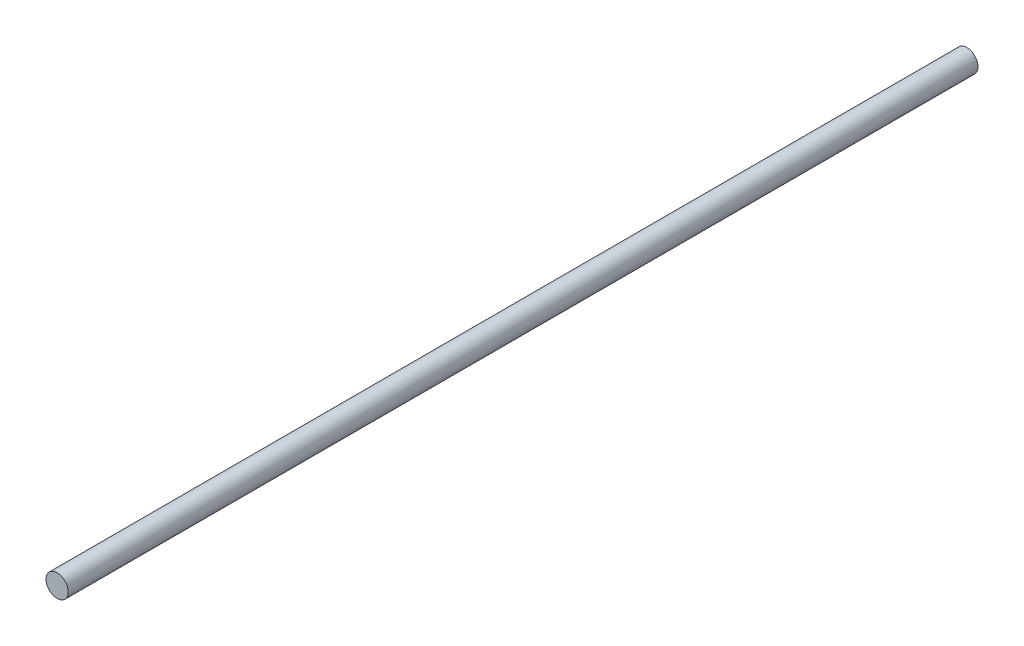
ISO-10303-21;
HEADER;
FILE_DESCRIPTION(('STEP AP214'),'2;1');
FILE_NAME('part.step','',(''),(''),'','','');
FILE_SCHEMA(('AUTOMOTIVE_DESIGN { 1 0 10303 214 1 1 1 1 }'));
ENDSEC;
DATA;
#1=APPLICATION_CONTEXT('core data for automotive mechanical design processes');
#2=APPLICATION_PROTOCOL_DEFINITION('international standard','automotive_design',2000,#1);
#3=PRODUCT_CONTEXT('',#1,'mechanical');
#4=PRODUCT('Part','Part','',(#3));
#5=PRODUCT_RELATED_PRODUCT_CATEGORY('part','',(#4));
#6=PRODUCT_DEFINITION_FORMATION('','',#4);
#7=PRODUCT_DEFINITION_CONTEXT('part definition',#1,'design');
#8=PRODUCT_DEFINITION('design','',#6,#7);
#9=PRODUCT_DEFINITION_SHAPE('','',#8);
#10=(LENGTH_UNIT() NAMED_UNIT(*) SI_UNIT(.MILLI.,.METRE.));
#11=(NAMED_UNIT(*) PLANE_ANGLE_UNIT() SI_UNIT($,.RADIAN.));
#12=(NAMED_UNIT(*) SI_UNIT($,.STERADIAN.) SOLID_ANGLE_UNIT());
#13=UNCERTAINTY_MEASURE_WITH_UNIT(LENGTH_MEASURE(1.E-05),#10,'distance_accuracy_value','');
#14=(GEOMETRIC_REPRESENTATION_CONTEXT(3) GLOBAL_UNCERTAINTY_ASSIGNED_CONTEXT((#13)) GLOBAL_UNIT_ASSIGNED_CONTEXT((#10,
#11,#12)) REPRESENTATION_CONTEXT('',''));
#15=CARTESIAN_POINT('',(0.,0.,0.));
#16=DIRECTION('',(0.,0.,1.));
#17=DIRECTION('',(1.,0.,0.));
#18=AXIS2_PLACEMENT_3D('',#15,#16,#17);
#19=CARTESIAN_POINT('',(0.,0.,245.));
#20=DIRECTION('',(0.,0.,-1.));
#21=DIRECTION('',(-1.,0.,0.));
#22=AXIS2_PLACEMENT_3D('',#19,#20,#21);
#23=CYLINDRICAL_SURFACE('',#22,3.);
#24=CARTESIAN_POINT('',(0.,0.,245.));
#25=DIRECTION('',(0.,0.,1.));
#26=DIRECTION('',(1.,0.,0.));
#27=AXIS2_PLACEMENT_3D('',#24,#25,#26);
#28=CIRCLE('',#27,3.);
#29=CARTESIAN_POINT('',(3.,0.,245.));
#30=VERTEX_POINT('',#29);
#31=EDGE_CURVE('E10',#30,#30,#28,.T.);
#32=ORIENTED_EDGE('',*,*,#31,.F.);
#33=EDGE_LOOP('',(#32));
#34=FACE_BOUND('',#33,.T.);
#35=CARTESIAN_POINT('',(0.,0.,0.));
#36=DIRECTION('',(0.,0.,1.));
#37=DIRECTION('',(1.,0.,0.));
#38=AXIS2_PLACEMENT_3D('',#35,#36,#37);
#39=CIRCLE('',#38,3.);
#40=CARTESIAN_POINT('',(3.,0.,0.));
#41=VERTEX_POINT('',#40);
#42=EDGE_CURVE('E40',#41,#41,#39,.T.);
#43=ORIENTED_EDGE('',*,*,#42,.T.);
#44=EDGE_LOOP('',(#43));
#45=FACE_BOUND('',#44,.T.);
#46=ADVANCED_FACE('F37',(#34,#45),#23,.T.);
#47=CARTESIAN_POINT('',(0.,0.,245.));
#48=DIRECTION('',(0.,0.,1.));
#49=DIRECTION('',(1.,0.,0.));
#50=AXIS2_PLACEMENT_3D('',#47,#48,#49);
#51=PLANE('',#50);
#52=ORIENTED_EDGE('',*,*,#31,.T.);
#53=EDGE_LOOP('',(#52));
#54=FACE_BOUND('',#53,.T.);
#55=ADVANCED_FACE('F54',(#54),#51,.T.);
#56=CARTESIAN_POINT('',(0.,0.,0.));
#57=DIRECTION('',(0.,0.,1.));
#58=DIRECTION('',(1.,0.,0.));
#59=AXIS2_PLACEMENT_3D('',#56,#57,#58);
#60=PLANE('',#59);
#61=ORIENTED_EDGE('',*,*,#42,.F.);
#62=EDGE_LOOP('',(#61));
#63=FACE_BOUND('',#62,.T.);
#64=ADVANCED_FACE('F52',(#63),#60,.F.);
#65=CLOSED_SHELL('',(#46,#55,#64));
#66=MANIFOLD_SOLID_BREP('B2',#65);
#67=ADVANCED_BREP_SHAPE_REPRESENTATION('',(#18,#66),#14);
#68=SHAPE_DEFINITION_REPRESENTATION(#9,#67);
ENDSEC;
END-ISO-10303-21;
